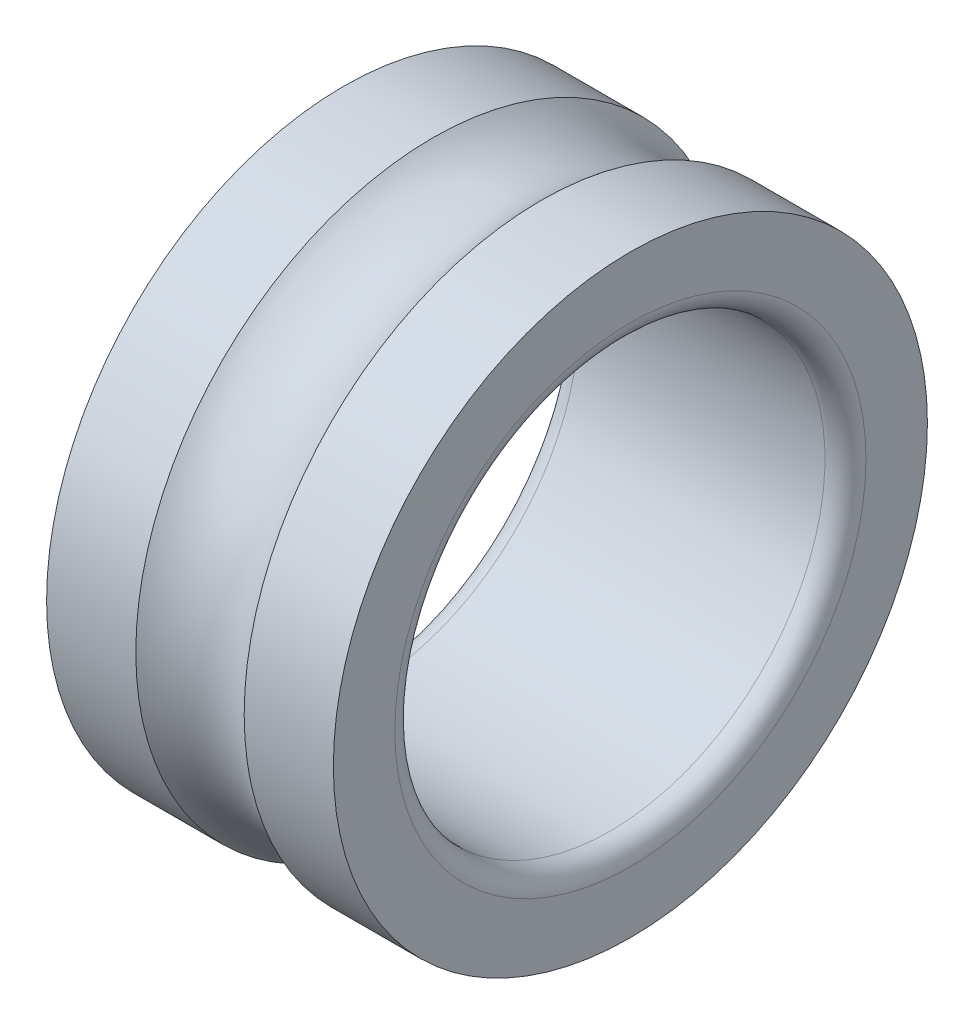
ISO-10303-21;
HEADER;
FILE_DESCRIPTION(('STEP AP214'),'2;1');
FILE_NAME('part.step','',(''),(''),'','','');
FILE_SCHEMA(('AUTOMOTIVE_DESIGN { 1 0 10303 214 1 1 1 1 }'));
ENDSEC;
DATA;
#1=APPLICATION_CONTEXT('core data for automotive mechanical design processes');
#2=APPLICATION_PROTOCOL_DEFINITION('international standard','automotive_design',2000,#1);
#3=PRODUCT_CONTEXT('',#1,'mechanical');
#4=PRODUCT('Part','Part','',(#3));
#5=PRODUCT_RELATED_PRODUCT_CATEGORY('part','',(#4));
#6=PRODUCT_DEFINITION_FORMATION('','',#4);
#7=PRODUCT_DEFINITION_CONTEXT('part definition',#1,'design');
#8=PRODUCT_DEFINITION('design','',#6,#7);
#9=PRODUCT_DEFINITION_SHAPE('','',#8);
#10=(LENGTH_UNIT() NAMED_UNIT(*) SI_UNIT(.MILLI.,.METRE.));
#11=(NAMED_UNIT(*) PLANE_ANGLE_UNIT() SI_UNIT($,.RADIAN.));
#12=(NAMED_UNIT(*) SI_UNIT($,.STERADIAN.) SOLID_ANGLE_UNIT());
#13=UNCERTAINTY_MEASURE_WITH_UNIT(LENGTH_MEASURE(1.E-05),#10,'distance_accuracy_value','');
#14=(GEOMETRIC_REPRESENTATION_CONTEXT(3) GLOBAL_UNCERTAINTY_ASSIGNED_CONTEXT((#13)) GLOBAL_UNIT_ASSIGNED_CONTEXT((#10,
#11,#12)) REPRESENTATION_CONTEXT('',''));
#15=CARTESIAN_POINT('',(0.,0.,0.));
#16=DIRECTION('',(0.,0.,1.));
#17=DIRECTION('',(1.,0.,0.));
#18=AXIS2_PLACEMENT_3D('',#15,#16,#17);
#19=CARTESIAN_POINT('',(0.,0.,0.));
#20=DIRECTION('',(-1.,0.,0.));
#21=DIRECTION('',(0.,0.,1.));
#22=AXIS2_PLACEMENT_3D('',#19,#20,#21);
#23=CYLINDRICAL_SURFACE('',#22,8.28571428571428);
#24=CARTESIAN_POINT('',(1.51185789203691,0.,0.));
#25=DIRECTION('',(-1.,0.,0.));
#26=DIRECTION('',(0.,0.,1.));
#27=AXIS2_PLACEMENT_3D('',#24,#25,#26);
#28=CIRCLE('',#27,8.28571428571428);
#29=CARTESIAN_POINT('',(1.51185789203691,0.,8.28571428571428));
#30=VERTEX_POINT('',#29);
#31=EDGE_CURVE('E376',#30,#30,#28,.T.);
#32=ORIENTED_EDGE('',*,*,#31,.F.);
#33=EDGE_LOOP('',(#32));
#34=FACE_BOUND('',#33,.T.);
#35=CARTESIAN_POINT('',(4.,0.,0.));
#36=DIRECTION('',(-1.,0.,0.));
#37=DIRECTION('',(0.,0.,1.));
#38=AXIS2_PLACEMENT_3D('',#35,#36,#37);
#39=CIRCLE('',#38,8.28571428571428);
#40=CARTESIAN_POINT('',(4.,0.,8.28571428571428));
#41=VERTEX_POINT('',#40);
#42=EDGE_CURVE('E10',#41,#41,#39,.T.);
#43=ORIENTED_EDGE('',*,*,#42,.T.);
#44=EDGE_LOOP('',(#43));
#45=FACE_BOUND('',#44,.T.);
#46=ADVANCED_FACE('F348',(#34,#45),#23,.T.);
#47=CARTESIAN_POINT('',(4.,6.57142857142857,0.));
#48=DIRECTION('',(-1.,0.,0.));
#49=DIRECTION('',(0.,0.,1.));
#50=AXIS2_PLACEMENT_3D('',#47,#48,#49);
#51=PLANE('',#50);
#52=ORIENTED_EDGE('',*,*,#42,.F.);
#53=EDGE_LOOP('',(#52));
#54=FACE_BOUND('',#53,.T.);
#55=CARTESIAN_POINT('',(4.,0.,0.));
#56=DIRECTION('',(-1.,0.,0.));
#57=DIRECTION('',(0.,0.,1.));
#58=AXIS2_PLACEMENT_3D('',#55,#56,#57);
#59=CIRCLE('',#58,6.57142857142857);
#60=CARTESIAN_POINT('',(4.,0.,6.57142857142857));
#61=VERTEX_POINT('',#60);
#62=EDGE_CURVE('E354',#61,#61,#59,.T.);
#63=ORIENTED_EDGE('',*,*,#62,.T.);
#64=EDGE_LOOP('',(#63));
#65=FACE_BOUND('',#64,.T.);
#66=ADVANCED_FACE('F383',(#54,#65),#51,.F.);
#67=CARTESIAN_POINT('',(3.42857142857143,0.,0.));
#68=DIRECTION('',(-1.,0.,0.));
#69=DIRECTION('',(0.,0.,1.));
#70=AXIS2_PLACEMENT_3D('',#67,#68,#69);
#71=TOROIDAL_SURFACE('',#70,6.57142857142857,0.571428571428572);
#72=ORIENTED_EDGE('',*,*,#62,.F.);
#73=EDGE_LOOP('',(#72));
#74=FACE_BOUND('',#73,.T.);
#75=CARTESIAN_POINT('',(3.42857142857143,0.,0.));
#76=DIRECTION('',(-1.,0.,0.));
#77=DIRECTION('',(0.,0.,1.));
#78=AXIS2_PLACEMENT_3D('',#75,#76,#77);
#79=CIRCLE('',#78,6.);
#80=CARTESIAN_POINT('',(3.42857142857143,0.,6.));
#81=VERTEX_POINT('',#80);
#82=EDGE_CURVE('E358',#81,#81,#79,.T.);
#83=ORIENTED_EDGE('',*,*,#82,.T.);
#84=EDGE_LOOP('',(#83));
#85=FACE_BOUND('',#84,.T.);
#86=ADVANCED_FACE('F387',(#74,#85),#71,.T.);
#87=CARTESIAN_POINT('',(0.,0.,0.));
#88=DIRECTION('',(-1.,0.,0.));
#89=DIRECTION('',(0.,0.,1.));
#90=AXIS2_PLACEMENT_3D('',#87,#88,#89);
#91=CYLINDRICAL_SURFACE('',#90,6.);
#92=ORIENTED_EDGE('',*,*,#82,.F.);
#93=EDGE_LOOP('',(#92));
#94=FACE_BOUND('',#93,.T.);
#95=CARTESIAN_POINT('',(-3.42857142857143,0.,0.));
#96=DIRECTION('',(-1.,0.,0.));
#97=DIRECTION('',(0.,0.,1.));
#98=AXIS2_PLACEMENT_3D('',#95,#96,#97);
#99=CIRCLE('',#98,6.);
#100=CARTESIAN_POINT('',(-3.42857142857143,0.,6.));
#101=VERTEX_POINT('',#100);
#102=EDGE_CURVE('E362',#101,#101,#99,.T.);
#103=ORIENTED_EDGE('',*,*,#102,.T.);
#104=EDGE_LOOP('',(#103));
#105=FACE_BOUND('',#104,.T.);
#106=ADVANCED_FACE('F392',(#94,#105),#91,.F.);
#107=CARTESIAN_POINT('',(-3.42857142857143,0.,0.));
#108=DIRECTION('',(-1.,0.,0.));
#109=DIRECTION('',(0.,0.,1.));
#110=AXIS2_PLACEMENT_3D('',#107,#108,#109);
#111=TOROIDAL_SURFACE('',#110,6.57142857142857,0.571428571428572);
#112=ORIENTED_EDGE('',*,*,#102,.F.);
#113=EDGE_LOOP('',(#112));
#114=FACE_BOUND('',#113,.T.);
#115=CARTESIAN_POINT('',(-4.,0.,0.));
#116=DIRECTION('',(-1.,0.,0.));
#117=DIRECTION('',(0.,0.,1.));
#118=AXIS2_PLACEMENT_3D('',#115,#116,#117);
#119=CIRCLE('',#118,6.57142857142857);
#120=CARTESIAN_POINT('',(-4.,0.,6.57142857142857));
#121=VERTEX_POINT('',#120);
#122=EDGE_CURVE('E367',#121,#121,#119,.T.);
#123=ORIENTED_EDGE('',*,*,#122,.T.);
#124=EDGE_LOOP('',(#123));
#125=FACE_BOUND('',#124,.T.);
#126=ADVANCED_FACE('F398',(#114,#125),#111,.T.);
#127=CARTESIAN_POINT('',(-4.,6.57142857142857,0.));
#128=DIRECTION('',(1.,0.,0.));
#129=DIRECTION('',(0.,0.,-1.));
#130=AXIS2_PLACEMENT_3D('',#127,#128,#129);
#131=PLANE('',#130);
#132=ORIENTED_EDGE('',*,*,#122,.F.);
#133=EDGE_LOOP('',(#132));
#134=FACE_BOUND('',#133,.T.);
#135=CARTESIAN_POINT('',(-4.,0.,0.));
#136=DIRECTION('',(-1.,0.,0.));
#137=DIRECTION('',(0.,0.,1.));
#138=AXIS2_PLACEMENT_3D('',#135,#136,#137);
#139=CIRCLE('',#138,8.28571428571428);
#140=CARTESIAN_POINT('',(-4.,0.,8.28571428571428));
#141=VERTEX_POINT('',#140);
#142=EDGE_CURVE('E370',#141,#141,#139,.T.);
#143=ORIENTED_EDGE('',*,*,#142,.T.);
#144=EDGE_LOOP('',(#143));
#145=FACE_BOUND('',#144,.T.);
#146=ADVANCED_FACE('F402',(#134,#145),#131,.F.);
#147=CARTESIAN_POINT('',(0.,0.,0.));
#148=DIRECTION('',(-1.,0.,0.));
#149=DIRECTION('',(0.,0.,1.));
#150=AXIS2_PLACEMENT_3D('',#147,#148,#149);
#151=CYLINDRICAL_SURFACE('',#150,8.28571428571428);
#152=ORIENTED_EDGE('',*,*,#142,.F.);
#153=EDGE_LOOP('',(#152));
#154=FACE_BOUND('',#153,.T.);
#155=CARTESIAN_POINT('',(-1.51185789203691,0.,0.));
#156=DIRECTION('',(-1.,0.,0.));
#157=DIRECTION('',(0.,0.,1.));
#158=AXIS2_PLACEMENT_3D('',#155,#156,#157);
#159=CIRCLE('',#158,8.28571428571428);
#160=CARTESIAN_POINT('',(-1.51185789203691,0.,8.28571428571428));
#161=VERTEX_POINT('',#160);
#162=EDGE_CURVE('E373',#161,#161,#159,.T.);
#163=ORIENTED_EDGE('',*,*,#162,.T.);
#164=EDGE_LOOP('',(#163));
#165=FACE_BOUND('',#164,.T.);
#166=ADVANCED_FACE('F406',(#154,#165),#151,.T.);
#167=CARTESIAN_POINT('',(0.,0.,0.));
#168=DIRECTION('',(-1.,0.,0.));
#169=DIRECTION('',(0.,0.,1.));
#170=AXIS2_PLACEMENT_3D('',#167,#168,#169);
#171=TOROIDAL_SURFACE('',#170,10.,2.28571428571429);
#172=ORIENTED_EDGE('',*,*,#162,.F.);
#173=EDGE_LOOP('',(#172));
#174=FACE_BOUND('',#173,.T.);
#175=ORIENTED_EDGE('',*,*,#31,.T.);
#176=EDGE_LOOP('',(#175));
#177=FACE_BOUND('',#176,.T.);
#178=ADVANCED_FACE('F380',(#174,#177),#171,.F.);
#179=CLOSED_SHELL('',(#46,#66,#86,#106,#126,#146,#166,#178));
#180=MANIFOLD_SOLID_BREP('B2',#179);
#181=ADVANCED_BREP_SHAPE_REPRESENTATION('',(#18,#180),#14);
#182=SHAPE_DEFINITION_REPRESENTATION(#9,#181);
ENDSEC;
END-ISO-10303-21;
